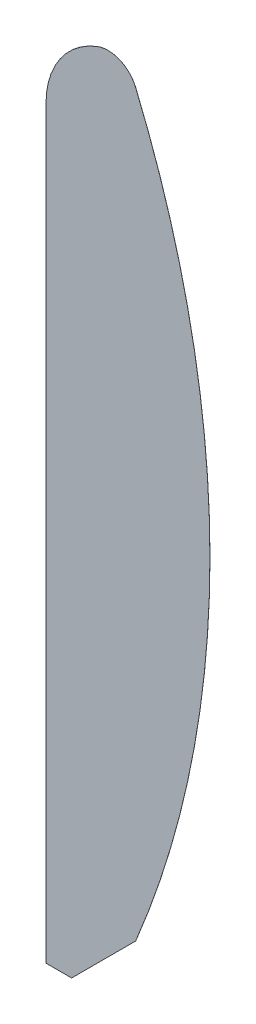
ISO-10303-21;
HEADER;
FILE_DESCRIPTION(('STEP AP214'),'2;1');
FILE_NAME('part.step','',(''),(''),'','','');
FILE_SCHEMA(('AUTOMOTIVE_DESIGN { 1 0 10303 214 1 1 1 1 }'));
ENDSEC;
DATA;
#1=APPLICATION_CONTEXT('core data for automotive mechanical design processes');
#2=APPLICATION_PROTOCOL_DEFINITION('international standard','automotive_design',2000,#1);
#3=PRODUCT_CONTEXT('',#1,'mechanical');
#4=PRODUCT('Part','Part','',(#3));
#5=PRODUCT_RELATED_PRODUCT_CATEGORY('part','',(#4));
#6=PRODUCT_DEFINITION_FORMATION('','',#4);
#7=PRODUCT_DEFINITION_CONTEXT('part definition',#1,'design');
#8=PRODUCT_DEFINITION('design','',#6,#7);
#9=PRODUCT_DEFINITION_SHAPE('','',#8);
#10=(LENGTH_UNIT() NAMED_UNIT(*) SI_UNIT(.MILLI.,.METRE.));
#11=(NAMED_UNIT(*) PLANE_ANGLE_UNIT() SI_UNIT($,.RADIAN.));
#12=(NAMED_UNIT(*) SI_UNIT($,.STERADIAN.) SOLID_ANGLE_UNIT());
#13=UNCERTAINTY_MEASURE_WITH_UNIT(LENGTH_MEASURE(1.E-05),#10,'distance_accuracy_value','');
#14=(GEOMETRIC_REPRESENTATION_CONTEXT(3) GLOBAL_UNCERTAINTY_ASSIGNED_CONTEXT((#13)) GLOBAL_UNIT_ASSIGNED_CONTEXT((#10,
#11,#12)) REPRESENTATION_CONTEXT('',''));
#15=CARTESIAN_POINT('',(0.,0.,0.));
#16=DIRECTION('',(0.,0.,1.));
#17=DIRECTION('',(1.,0.,0.));
#18=AXIS2_PLACEMENT_3D('',#15,#16,#17);
#19=CARTESIAN_POINT('',(0.,0.,0.01));
#20=DIRECTION('',(0.,1.,0.));
#21=DIRECTION('',(-1.,0.,0.));
#22=AXIS2_PLACEMENT_3D('',#19,#20,#21);
#23=PLANE('',#22);
#24=DIRECTION('',(1.,0.,0.));
#25=VECTOR('',#24,1.);
#26=CARTESIAN_POINT('',(0.,0.,0.));
#27=LINE('',#26,#25);
#28=CARTESIAN_POINT('',(0.,0.,0.));
#29=VERTEX_POINT('',#28);
#30=CARTESIAN_POINT('',(5.,0.,0.));
#31=VERTEX_POINT('',#30);
#32=EDGE_CURVE('E122',#29,#31,#27,.T.);
#33=ORIENTED_EDGE('',*,*,#32,.T.);
#34=DIRECTION('',(0.,0.,-1.));
#35=VECTOR('',#34,1.);
#36=CARTESIAN_POINT('',(5.,0.,0.01));
#37=LINE('',#36,#35);
#38=CARTESIAN_POINT('',(5.,0.,0.01));
#39=VERTEX_POINT('',#38);
#40=EDGE_CURVE('E11',#39,#31,#37,.T.);
#41=ORIENTED_EDGE('',*,*,#40,.F.);
#42=DIRECTION('',(1.,0.,0.));
#43=VECTOR('',#42,1.);
#44=CARTESIAN_POINT('',(0.,0.,0.01));
#45=LINE('',#44,#43);
#46=CARTESIAN_POINT('',(0.,0.,0.01));
#47=VERTEX_POINT('',#46);
#48=EDGE_CURVE('E138',#47,#39,#45,.T.);
#49=ORIENTED_EDGE('',*,*,#48,.F.);
#50=DIRECTION('',(0.,0.,-1.));
#51=VECTOR('',#50,1.);
#52=CARTESIAN_POINT('',(0.,0.,0.01));
#53=LINE('',#52,#51);
#54=EDGE_CURVE('E54',#47,#29,#53,.T.);
#55=ORIENTED_EDGE('',*,*,#54,.T.);
#56=EDGE_LOOP('',(#33,#41,#49,#55));
#57=FACE_BOUND('',#56,.T.);
#58=ADVANCED_FACE('F39',(#57),#23,.F.);
#59=CARTESIAN_POINT('',(5.,0.,0.01));
#60=DIRECTION('',(-0.707106781186547,0.707106781186547,0.));
#61=DIRECTION('',(-0.707106781186548,-0.707106781186548,0.));
#62=AXIS2_PLACEMENT_3D('',#59,#60,#61);
#63=PLANE('',#62);
#64=DIRECTION('',(0.707106781186547,0.707106781186547,0.));
#65=VECTOR('',#64,1.);
#66=CARTESIAN_POINT('',(5.,0.,0.));
#67=LINE('',#66,#65);
#68=CARTESIAN_POINT('',(17.5,12.4999999999999,0.));
#69=VERTEX_POINT('',#68);
#70=EDGE_CURVE('E121',#31,#69,#67,.T.);
#71=ORIENTED_EDGE('',*,*,#70,.T.);
#72=DIRECTION('',(0.,0.,-1.));
#73=VECTOR('',#72,1.);
#74=CARTESIAN_POINT('',(17.5,12.4999999999999,0.01));
#75=LINE('',#74,#73);
#76=CARTESIAN_POINT('',(17.5,12.4999999999999,0.01));
#77=VERTEX_POINT('',#76);
#78=EDGE_CURVE('E50',#77,#69,#75,.T.);
#79=ORIENTED_EDGE('',*,*,#78,.F.);
#80=DIRECTION('',(0.707106781186547,0.707106781186547,0.));
#81=VECTOR('',#80,1.);
#82=CARTESIAN_POINT('',(5.,0.,0.01));
#83=LINE('',#82,#81);
#84=EDGE_CURVE('E87',#39,#77,#83,.T.);
#85=ORIENTED_EDGE('',*,*,#84,.F.);
#86=ORIENTED_EDGE('',*,*,#40,.T.);
#87=EDGE_LOOP('',(#71,#79,#85,#86));
#88=FACE_BOUND('',#87,.T.);
#89=ADVANCED_FACE('F156',(#88),#63,.F.);
#90=CARTESIAN_POINT('',(-154.749623006426,84.6490753037512,0.01));
#91=DIRECTION('',(0.,0.,-1.));
#92=DIRECTION('',(-1.,0.,0.));
#93=AXIS2_PLACEMENT_3D('',#90,#91,#92);
#94=CYLINDRICAL_SURFACE('',#93,186.749623006426);
#95=CARTESIAN_POINT('',(-154.749623006426,84.6490753037512,0.));
#96=DIRECTION('',(0.,0.,1.));
#97=DIRECTION('',(1.,0.,0.));
#98=AXIS2_PLACEMENT_3D('',#95,#96,#97);
#99=CIRCLE('',#98,186.749623006426);
#100=CARTESIAN_POINT('',(17.5,156.798150607502,0.));
#101=VERTEX_POINT('',#100);
#102=EDGE_CURVE('E130',#69,#101,#99,.T.);
#103=ORIENTED_EDGE('',*,*,#102,.T.);
#104=DIRECTION('',(0.,0.,-1.));
#105=VECTOR('',#104,1.);
#106=CARTESIAN_POINT('',(17.5,156.798150607502,0.01));
#107=LINE('',#106,#105);
#108=CARTESIAN_POINT('',(17.5,156.798150607502,0.01));
#109=VERTEX_POINT('',#108);
#110=EDGE_CURVE('E106',#109,#101,#107,.T.);
#111=ORIENTED_EDGE('',*,*,#110,.F.);
#112=CARTESIAN_POINT('',(-154.749623006426,84.6490753037512,0.01));
#113=DIRECTION('',(0.,0.,1.));
#114=DIRECTION('',(1.,0.,0.));
#115=AXIS2_PLACEMENT_3D('',#112,#113,#114);
#116=CIRCLE('',#115,186.749623006426);
#117=EDGE_CURVE('E111',#77,#109,#116,.T.);
#118=ORIENTED_EDGE('',*,*,#117,.F.);
#119=ORIENTED_EDGE('',*,*,#78,.T.);
#120=EDGE_LOOP('',(#103,#111,#118,#119));
#121=FACE_BOUND('',#120,.T.);
#122=ADVANCED_FACE('F142',(#121),#94,.T.);
#123=CARTESIAN_POINT('',(12.101126238797,154.536759593962,0.01));
#124=DIRECTION('',(0.,0.,-1.));
#125=DIRECTION('',(-1.,0.,0.));
#126=AXIS2_PLACEMENT_3D('',#123,#124,#125);
#127=CYLINDRICAL_SURFACE('',#126,5.85335179239459);
#128=CARTESIAN_POINT('',(12.101126238797,154.536759593962,0.));
#129=DIRECTION('',(0.,0.,-1.));
#130=DIRECTION('',(-1.,0.,0.));
#131=AXIS2_PLACEMENT_3D('',#128,#129,#130);
#132=CIRCLE('',#131,5.85335179239459);
#133=CARTESIAN_POINT('',(10.,160.,0.));
#134=VERTEX_POINT('',#133);
#135=EDGE_CURVE('E105',#134,#101,#132,.T.);
#136=ORIENTED_EDGE('',*,*,#135,.F.);
#137=DIRECTION('',(0.,0.,-1.));
#138=VECTOR('',#137,1.);
#139=CARTESIAN_POINT('',(10.,160.,0.01));
#140=LINE('',#139,#138);
#141=CARTESIAN_POINT('',(10.,160.,0.01));
#142=VERTEX_POINT('',#141);
#143=EDGE_CURVE('E100',#142,#134,#140,.T.);
#144=ORIENTED_EDGE('',*,*,#143,.F.);
#145=CARTESIAN_POINT('',(12.101126238797,154.536759593962,0.01));
#146=DIRECTION('',(0.,0.,-1.));
#147=DIRECTION('',(-1.,0.,0.));
#148=AXIS2_PLACEMENT_3D('',#145,#146,#147);
#149=CIRCLE('',#148,5.85335179239459);
#150=EDGE_CURVE('E99',#142,#109,#149,.T.);
#151=ORIENTED_EDGE('',*,*,#150,.T.);
#152=ORIENTED_EDGE('',*,*,#110,.T.);
#153=EDGE_LOOP('',(#136,#144,#151,#152));
#154=FACE_BOUND('',#153,.T.);
#155=ADVANCED_FACE('F97',(#154),#127,.T.);
#156=CARTESIAN_POINT('',(15.59968,145.44,0.01));
#157=DIRECTION('',(0.,0.,-1.));
#158=DIRECTION('',(-1.,0.,0.));
#159=AXIS2_PLACEMENT_3D('',#156,#157,#158);
#160=CYLINDRICAL_SURFACE('',#159,15.59968);
#161=CARTESIAN_POINT('',(15.59968,145.44,0.));
#162=DIRECTION('',(0.,0.,-1.));
#163=DIRECTION('',(-1.,0.,0.));
#164=AXIS2_PLACEMENT_3D('',#161,#162,#163);
#165=CIRCLE('',#164,15.59968);
#166=CARTESIAN_POINT('',(0.,145.44,0.));
#167=VERTEX_POINT('',#166);
#168=EDGE_CURVE('E132',#167,#134,#165,.T.);
#169=ORIENTED_EDGE('',*,*,#168,.F.);
#170=DIRECTION('',(0.,0.,-1.));
#171=VECTOR('',#170,1.);
#172=CARTESIAN_POINT('',(0.,145.44,0.01));
#173=LINE('',#172,#171);
#174=CARTESIAN_POINT('',(0.,145.44,0.01));
#175=VERTEX_POINT('',#174);
#176=EDGE_CURVE('E73',#175,#167,#173,.T.);
#177=ORIENTED_EDGE('',*,*,#176,.F.);
#178=CARTESIAN_POINT('',(15.59968,145.44,0.01));
#179=DIRECTION('',(0.,0.,-1.));
#180=DIRECTION('',(-1.,0.,0.));
#181=AXIS2_PLACEMENT_3D('',#178,#179,#180);
#182=CIRCLE('',#181,15.59968);
#183=EDGE_CURVE('E115',#175,#142,#182,.T.);
#184=ORIENTED_EDGE('',*,*,#183,.T.);
#185=ORIENTED_EDGE('',*,*,#143,.T.);
#186=EDGE_LOOP('',(#169,#177,#184,#185));
#187=FACE_BOUND('',#186,.T.);
#188=ADVANCED_FACE('F120',(#187),#160,.T.);
#189=CARTESIAN_POINT('',(0.,0.,0.01));
#190=DIRECTION('',(-1.,0.,0.));
#191=DIRECTION('',(0.,-1.,0.));
#192=AXIS2_PLACEMENT_3D('',#189,#190,#191);
#193=PLANE('',#192);
#194=DIRECTION('',(0.,1.,0.));
#195=VECTOR('',#194,1.);
#196=CARTESIAN_POINT('',(0.,0.,0.));
#197=LINE('',#196,#195);
#198=EDGE_CURVE('E134',#29,#167,#197,.T.);
#199=ORIENTED_EDGE('',*,*,#198,.F.);
#200=ORIENTED_EDGE('',*,*,#54,.F.);
#201=DIRECTION('',(0.,1.,0.));
#202=VECTOR('',#201,1.);
#203=CARTESIAN_POINT('',(0.,0.,0.01));
#204=LINE('',#203,#202);
#205=EDGE_CURVE('E119',#47,#175,#204,.T.);
#206=ORIENTED_EDGE('',*,*,#205,.T.);
#207=ORIENTED_EDGE('',*,*,#176,.T.);
#208=EDGE_LOOP('',(#199,#200,#206,#207));
#209=FACE_BOUND('',#208,.T.);
#210=ADVANCED_FACE('F144',(#209),#193,.T.);
#211=CARTESIAN_POINT('',(-154.749623006426,84.6490753037512,0.01));
#212=DIRECTION('',(0.,0.,1.));
#213=DIRECTION('',(1.,0.,0.));
#214=AXIS2_PLACEMENT_3D('',#211,#212,#213);
#215=PLANE('',#214);
#216=ORIENTED_EDGE('',*,*,#48,.T.);
#217=ORIENTED_EDGE('',*,*,#84,.T.);
#218=ORIENTED_EDGE('',*,*,#117,.T.);
#219=ORIENTED_EDGE('',*,*,#150,.F.);
#220=ORIENTED_EDGE('',*,*,#183,.F.);
#221=ORIENTED_EDGE('',*,*,#205,.F.);
#222=EDGE_LOOP('',(#216,#217,#218,#219,#220,#221));
#223=FACE_BOUND('',#222,.T.);
#224=ADVANCED_FACE('F109',(#223),#215,.T.);
#225=CARTESIAN_POINT('',(-154.749623006426,84.6490753037512,0.));
#226=DIRECTION('',(0.,0.,1.));
#227=DIRECTION('',(1.,0.,0.));
#228=AXIS2_PLACEMENT_3D('',#225,#226,#227);
#229=PLANE('',#228);
#230=ORIENTED_EDGE('',*,*,#32,.F.);
#231=ORIENTED_EDGE('',*,*,#198,.T.);
#232=ORIENTED_EDGE('',*,*,#168,.T.);
#233=ORIENTED_EDGE('',*,*,#135,.T.);
#234=ORIENTED_EDGE('',*,*,#102,.F.);
#235=ORIENTED_EDGE('',*,*,#70,.F.);
#236=EDGE_LOOP('',(#230,#231,#232,#233,#234,#235));
#237=FACE_BOUND('',#236,.T.);
#238=ADVANCED_FACE('F145',(#237),#229,.F.);
#239=CLOSED_SHELL('',(#58,#89,#122,#155,#188,#210,#224,#238));
#240=MANIFOLD_SOLID_BREP('B2',#239);
#241=ADVANCED_BREP_SHAPE_REPRESENTATION('',(#18,#240),#14);
#242=SHAPE_DEFINITION_REPRESENTATION(#9,#241);
ENDSEC;
END-ISO-10303-21;
